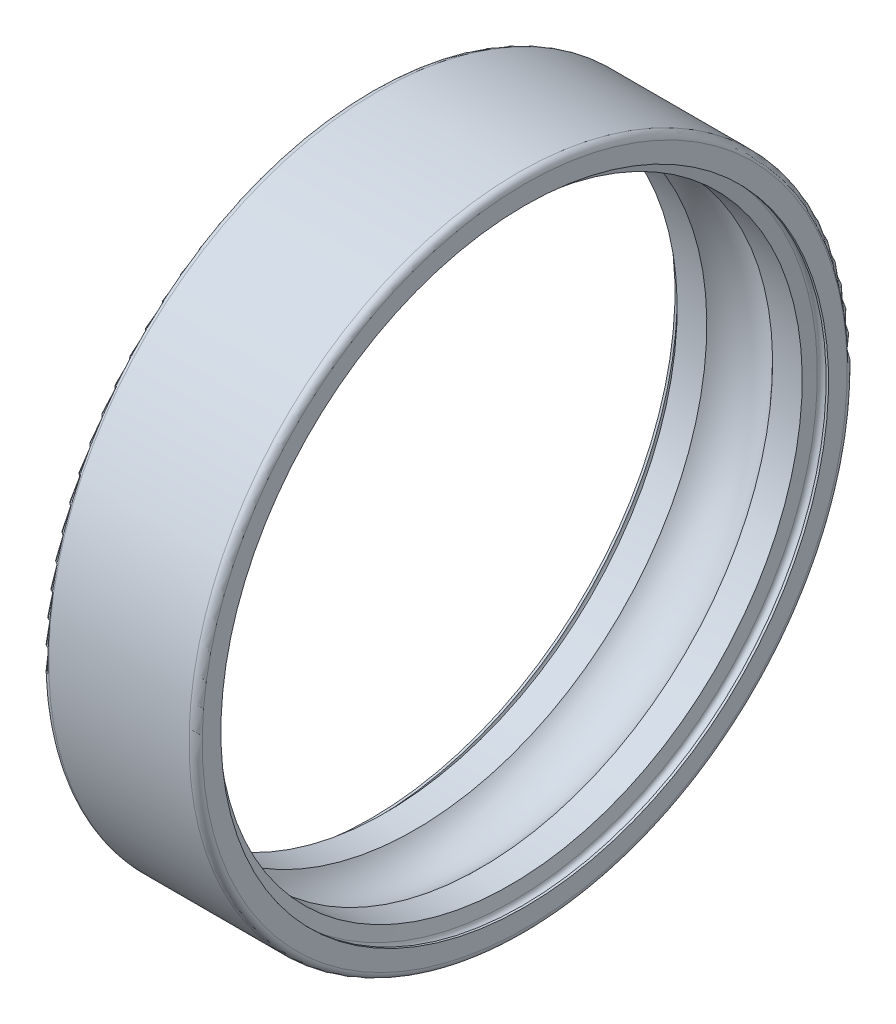
ISO-10303-21;
HEADER;
FILE_DESCRIPTION(('STEP AP214'),'2;1');
FILE_NAME('part.step','',(''),(''),'','','');
FILE_SCHEMA(('AUTOMOTIVE_DESIGN { 1 0 10303 214 1 1 1 1 }'));
ENDSEC;
DATA;
#1=APPLICATION_CONTEXT('core data for automotive mechanical design processes');
#2=APPLICATION_PROTOCOL_DEFINITION('international standard','automotive_design',2000,#1);
#3=PRODUCT_CONTEXT('',#1,'mechanical');
#4=PRODUCT('Part','Part','',(#3));
#5=PRODUCT_RELATED_PRODUCT_CATEGORY('part','',(#4));
#6=PRODUCT_DEFINITION_FORMATION('','',#4);
#7=PRODUCT_DEFINITION_CONTEXT('part definition',#1,'design');
#8=PRODUCT_DEFINITION('design','',#6,#7);
#9=PRODUCT_DEFINITION_SHAPE('','',#8);
#10=(LENGTH_UNIT() NAMED_UNIT(*) SI_UNIT(.MILLI.,.METRE.));
#11=(NAMED_UNIT(*) PLANE_ANGLE_UNIT() SI_UNIT($,.RADIAN.));
#12=(NAMED_UNIT(*) SI_UNIT($,.STERADIAN.) SOLID_ANGLE_UNIT());
#13=UNCERTAINTY_MEASURE_WITH_UNIT(LENGTH_MEASURE(1.E-05),#10,'distance_accuracy_value','');
#14=(GEOMETRIC_REPRESENTATION_CONTEXT(3) GLOBAL_UNCERTAINTY_ASSIGNED_CONTEXT((#13)) GLOBAL_UNIT_ASSIGNED_CONTEXT((#10,
#11,#12)) REPRESENTATION_CONTEXT('',''));
#15=CARTESIAN_POINT('',(0.,0.,0.));
#16=DIRECTION('',(0.,0.,1.));
#17=DIRECTION('',(1.,0.,0.));
#18=AXIS2_PLACEMENT_3D('',#15,#16,#17);
#19=CARTESIAN_POINT('',(6.67,0.,0.));
#20=DIRECTION('',(1.,0.,0.));
#21=DIRECTION('',(0.,0.,-1.));
#22=AXIS2_PLACEMENT_3D('',#19,#20,#21);
#23=TOROIDAL_SURFACE('',#22,13.85,0.22);
#24=CARTESIAN_POINT('',(6.89,0.,0.));
#25=DIRECTION('',(1.,0.,0.));
#26=DIRECTION('',(0.,1.,0.));
#27=AXIS2_PLACEMENT_3D('',#24,#25,#26);
#28=CIRCLE('',#27,13.85);
#29=CARTESIAN_POINT('',(6.89,13.85,0.));
#30=VERTEX_POINT('',#29);
#31=EDGE_CURVE('E10',#30,#30,#28,.T.);
#32=ORIENTED_EDGE('',*,*,#31,.T.);
#33=EDGE_LOOP('',(#32));
#34=FACE_BOUND('',#33,.T.);
#35=CARTESIAN_POINT('',(6.45334229433732,0.,0.));
#36=DIRECTION('',(1.,0.,0.));
#37=DIRECTION('',(0.,1.,0.));
#38=AXIS2_PLACEMENT_3D('',#35,#36,#37);
#39=CIRCLE('',#38,13.8882025990867);
#40=CARTESIAN_POINT('',(6.45334229433732,13.8882025990867,0.));
#41=VERTEX_POINT('',#40);
#42=EDGE_CURVE('E82',#41,#41,#39,.T.);
#43=ORIENTED_EDGE('',*,*,#42,.F.);
#44=EDGE_LOOP('',(#43));
#45=FACE_BOUND('',#44,.T.);
#46=ADVANCED_FACE('F15',(#34,#45),#23,.F.);
#47=CARTESIAN_POINT('',(6.945,0.,0.));
#48=DIRECTION('',(-1.,0.,0.));
#49=DIRECTION('',(0.,1.,0.));
#50=AXIS2_PLACEMENT_3D('',#47,#48,#49);
#51=CYLINDRICAL_SURFACE('',#50,13.85);
#52=CARTESIAN_POINT('',(7.,0.,0.));
#53=DIRECTION('',(1.,0.,0.));
#54=DIRECTION('',(0.,1.,0.));
#55=AXIS2_PLACEMENT_3D('',#52,#53,#54);
#56=CIRCLE('',#55,13.85);
#57=CARTESIAN_POINT('',(7.,13.85,0.));
#58=VERTEX_POINT('',#57);
#59=EDGE_CURVE('E25',#58,#58,#56,.T.);
#60=ORIENTED_EDGE('',*,*,#59,.T.);
#61=EDGE_LOOP('',(#60));
#62=FACE_BOUND('',#61,.T.);
#63=ORIENTED_EDGE('',*,*,#31,.F.);
#64=EDGE_LOOP('',(#63));
#65=FACE_BOUND('',#64,.T.);
#66=ADVANCED_FACE('F121',(#62,#65),#51,.F.);
#67=CARTESIAN_POINT('',(7.,14.275,0.));
#68=DIRECTION('',(1.,0.,0.));
#69=DIRECTION('',(0.,1.,0.));
#70=AXIS2_PLACEMENT_3D('',#67,#68,#69);
#71=PLANE('',#70);
#72=CARTESIAN_POINT('',(7.,0.,0.));
#73=DIRECTION('',(1.,0.,0.));
#74=DIRECTION('',(0.,1.,0.));
#75=AXIS2_PLACEMENT_3D('',#72,#73,#74);
#76=CIRCLE('',#75,14.7);
#77=CARTESIAN_POINT('',(7.,14.7,0.));
#78=VERTEX_POINT('',#77);
#79=EDGE_CURVE('E87',#78,#78,#76,.T.);
#80=ORIENTED_EDGE('',*,*,#79,.T.);
#81=EDGE_LOOP('',(#80));
#82=FACE_BOUND('',#81,.T.);
#83=ORIENTED_EDGE('',*,*,#59,.F.);
#84=EDGE_LOOP('',(#83));
#85=FACE_BOUND('',#84,.T.);
#86=ADVANCED_FACE('F125',(#82,#85),#71,.T.);
#87=CARTESIAN_POINT('',(6.7,0.,0.));
#88=DIRECTION('',(1.,0.,0.));
#89=DIRECTION('',(0.,0.,-1.));
#90=AXIS2_PLACEMENT_3D('',#87,#88,#89);
#91=TOROIDAL_SURFACE('',#90,14.7,0.3);
#92=CARTESIAN_POINT('',(6.7,0.,0.));
#93=DIRECTION('',(1.,0.,0.));
#94=DIRECTION('',(0.,1.,0.));
#95=AXIS2_PLACEMENT_3D('',#92,#93,#94);
#96=CIRCLE('',#95,15.);
#97=CARTESIAN_POINT('',(6.7,15.,0.));
#98=VERTEX_POINT('',#97);
#99=EDGE_CURVE('E85',#98,#98,#96,.T.);
#100=ORIENTED_EDGE('',*,*,#99,.T.);
#101=EDGE_LOOP('',(#100));
#102=FACE_BOUND('',#101,.T.);
#103=ORIENTED_EDGE('',*,*,#79,.F.);
#104=EDGE_LOOP('',(#103));
#105=FACE_BOUND('',#104,.T.);
#106=ADVANCED_FACE('F129',(#102,#105),#91,.T.);
#107=CARTESIAN_POINT('',(3.5,0.,0.));
#108=DIRECTION('',(-1.,0.,0.));
#109=DIRECTION('',(0.,1.,0.));
#110=AXIS2_PLACEMENT_3D('',#107,#108,#109);
#111=CYLINDRICAL_SURFACE('',#110,15.);
#112=CARTESIAN_POINT('',(0.3,0.,0.));
#113=DIRECTION('',(1.,0.,0.));
#114=DIRECTION('',(0.,1.,0.));
#115=AXIS2_PLACEMENT_3D('',#112,#113,#114);
#116=CIRCLE('',#115,15.);
#117=CARTESIAN_POINT('',(0.3,15.,0.));
#118=VERTEX_POINT('',#117);
#119=EDGE_CURVE('E83',#118,#118,#116,.T.);
#120=ORIENTED_EDGE('',*,*,#119,.T.);
#121=EDGE_LOOP('',(#120));
#122=FACE_BOUND('',#121,.T.);
#123=ORIENTED_EDGE('',*,*,#99,.F.);
#124=EDGE_LOOP('',(#123));
#125=FACE_BOUND('',#124,.T.);
#126=ADVANCED_FACE('F131',(#122,#125),#111,.T.);
#127=CARTESIAN_POINT('',(0.3,0.,0.));
#128=DIRECTION('',(1.,0.,0.));
#129=DIRECTION('',(0.,0.,-1.));
#130=AXIS2_PLACEMENT_3D('',#127,#128,#129);
#131=TOROIDAL_SURFACE('',#130,14.7,0.3);
#132=CARTESIAN_POINT('',(0.,0.,0.));
#133=DIRECTION('',(1.,0.,0.));
#134=DIRECTION('',(0.,1.,0.));
#135=AXIS2_PLACEMENT_3D('',#132,#133,#134);
#136=CIRCLE('',#135,14.7);
#137=CARTESIAN_POINT('',(0.,14.7,0.));
#138=VERTEX_POINT('',#137);
#139=EDGE_CURVE('E86',#138,#138,#136,.T.);
#140=ORIENTED_EDGE('',*,*,#139,.T.);
#141=EDGE_LOOP('',(#140));
#142=FACE_BOUND('',#141,.T.);
#143=ORIENTED_EDGE('',*,*,#119,.F.);
#144=EDGE_LOOP('',(#143));
#145=FACE_BOUND('',#144,.T.);
#146=ADVANCED_FACE('F156',(#142,#145),#131,.T.);
#147=CARTESIAN_POINT('',(0.,14.275,0.));
#148=DIRECTION('',(-1.,0.,0.));
#149=DIRECTION('',(0.,-1.,0.));
#150=AXIS2_PLACEMENT_3D('',#147,#148,#149);
#151=PLANE('',#150);
#152=CARTESIAN_POINT('',(0.,0.,0.));
#153=DIRECTION('',(1.,0.,0.));
#154=DIRECTION('',(0.,1.,0.));
#155=AXIS2_PLACEMENT_3D('',#152,#153,#154);
#156=CIRCLE('',#155,13.85);
#157=CARTESIAN_POINT('',(0.,13.85,0.));
#158=VERTEX_POINT('',#157);
#159=EDGE_CURVE('E88',#158,#158,#156,.T.);
#160=ORIENTED_EDGE('',*,*,#159,.T.);
#161=EDGE_LOOP('',(#160));
#162=FACE_BOUND('',#161,.T.);
#163=ORIENTED_EDGE('',*,*,#139,.F.);
#164=EDGE_LOOP('',(#163));
#165=FACE_BOUND('',#164,.T.);
#166=ADVANCED_FACE('F148',(#162,#165),#151,.T.);
#167=CARTESIAN_POINT('',(0.055,0.,0.));
#168=DIRECTION('',(-1.,0.,0.));
#169=DIRECTION('',(0.,1.,0.));
#170=AXIS2_PLACEMENT_3D('',#167,#168,#169);
#171=CYLINDRICAL_SURFACE('',#170,13.85);
#172=CARTESIAN_POINT('',(0.11,0.,0.));
#173=DIRECTION('',(1.,0.,0.));
#174=DIRECTION('',(0.,1.,0.));
#175=AXIS2_PLACEMENT_3D('',#172,#173,#174);
#176=CIRCLE('',#175,13.85);
#177=CARTESIAN_POINT('',(0.11,13.85,0.));
#178=VERTEX_POINT('',#177);
#179=EDGE_CURVE('E74',#178,#178,#176,.T.);
#180=ORIENTED_EDGE('',*,*,#179,.T.);
#181=EDGE_LOOP('',(#180));
#182=FACE_BOUND('',#181,.T.);
#183=ORIENTED_EDGE('',*,*,#159,.F.);
#184=EDGE_LOOP('',(#183));
#185=FACE_BOUND('',#184,.T.);
#186=ADVANCED_FACE('F143',(#182,#185),#171,.F.);
#187=CARTESIAN_POINT('',(0.33,0.,0.));
#188=DIRECTION('',(1.,0.,0.));
#189=DIRECTION('',(0.,0.,-1.));
#190=AXIS2_PLACEMENT_3D('',#187,#188,#189);
#191=TOROIDAL_SURFACE('',#190,13.85,0.22);
#192=CARTESIAN_POINT('',(0.546657705662685,0.,0.));
#193=DIRECTION('',(1.,0.,0.));
#194=DIRECTION('',(0.,1.,0.));
#195=AXIS2_PLACEMENT_3D('',#192,#193,#194);
#196=CIRCLE('',#195,13.8882025990867);
#197=CARTESIAN_POINT('',(0.546657705662685,13.8882025990867,0.));
#198=VERTEX_POINT('',#197);
#199=EDGE_CURVE('E65',#198,#198,#196,.T.);
#200=ORIENTED_EDGE('',*,*,#199,.T.);
#201=EDGE_LOOP('',(#200));
#202=FACE_BOUND('',#201,.T.);
#203=ORIENTED_EDGE('',*,*,#179,.F.);
#204=EDGE_LOOP('',(#203));
#205=FACE_BOUND('',#204,.T.);
#206=ADVANCED_FACE('F138',(#202,#205),#191,.F.);
#207=CARTESIAN_POINT('',(0.598515699833602,0.,0.));
#208=DIRECTION('',(-1.,0.,0.));
#209=DIRECTION('',(0.,1.,0.));
#210=AXIS2_PLACEMENT_3D('',#207,#208,#209);
#211=CONICAL_SURFACE('',#210,13.5941012995434,1.39626340159546);
#212=CARTESIAN_POINT('',(0.650373694004519,0.,0.));
#213=DIRECTION('',(1.,0.,0.));
#214=DIRECTION('',(0.,1.,0.));
#215=AXIS2_PLACEMENT_3D('',#212,#213,#214);
#216=CIRCLE('',#215,13.3);
#217=CARTESIAN_POINT('',(0.650373694004519,13.3,0.));
#218=VERTEX_POINT('',#217);
#219=EDGE_CURVE('E70',#218,#218,#216,.T.);
#220=ORIENTED_EDGE('',*,*,#219,.T.);
#221=EDGE_LOOP('',(#220));
#222=FACE_BOUND('',#221,.T.);
#223=ORIENTED_EDGE('',*,*,#199,.F.);
#224=EDGE_LOOP('',(#223));
#225=FACE_BOUND('',#224,.T.);
#226=ADVANCED_FACE('F17',(#222,#225),#211,.F.);
#227=CARTESIAN_POINT('',(1.32548019603803,0.,0.));
#228=DIRECTION('',(-1.,0.,0.));
#229=DIRECTION('',(0.,1.,0.));
#230=AXIS2_PLACEMENT_3D('',#227,#228,#229);
#231=CYLINDRICAL_SURFACE('',#230,13.3);
#232=CARTESIAN_POINT('',(2.00058669807154,0.,0.));
#233=DIRECTION('',(1.,0.,0.));
#234=DIRECTION('',(0.,1.,0.));
#235=AXIS2_PLACEMENT_3D('',#232,#233,#234);
#236=CIRCLE('',#235,13.3);
#237=CARTESIAN_POINT('',(2.00058669807154,13.3,0.));
#238=VERTEX_POINT('',#237);
#239=EDGE_CURVE('E19',#238,#238,#236,.T.);
#240=ORIENTED_EDGE('',*,*,#239,.T.);
#241=EDGE_LOOP('',(#240));
#242=FACE_BOUND('',#241,.T.);
#243=ORIENTED_EDGE('',*,*,#219,.F.);
#244=EDGE_LOOP('',(#243));
#245=FACE_BOUND('',#244,.T.);
#246=ADVANCED_FACE('F116',(#242,#245),#231,.F.);
#247=CARTESIAN_POINT('',(3.5,0.,0.));
#248=DIRECTION('',(1.,0.,0.));
#249=DIRECTION('',(0.,0.,-1.));
#250=AXIS2_PLACEMENT_3D('',#247,#248,#249);
#251=TOROIDAL_SURFACE('',#250,12.,1.9845);
#252=CARTESIAN_POINT('',(4.99941330192846,0.,0.));
#253=DIRECTION('',(1.,0.,0.));
#254=DIRECTION('',(0.,1.,0.));
#255=AXIS2_PLACEMENT_3D('',#252,#253,#254);
#256=CIRCLE('',#255,13.3);
#257=CARTESIAN_POINT('',(4.99941330192846,13.3,0.));
#258=VERTEX_POINT('',#257);
#259=EDGE_CURVE('E76',#258,#258,#256,.T.);
#260=ORIENTED_EDGE('',*,*,#259,.T.);
#261=EDGE_LOOP('',(#260));
#262=FACE_BOUND('',#261,.T.);
#263=ORIENTED_EDGE('',*,*,#239,.F.);
#264=EDGE_LOOP('',(#263));
#265=FACE_BOUND('',#264,.T.);
#266=ADVANCED_FACE('F102',(#262,#265),#251,.F.);
#267=CARTESIAN_POINT('',(5.67451980396197,0.,0.));
#268=DIRECTION('',(-1.,0.,0.));
#269=DIRECTION('',(0.,1.,0.));
#270=AXIS2_PLACEMENT_3D('',#267,#268,#269);
#271=CYLINDRICAL_SURFACE('',#270,13.3);
#272=CARTESIAN_POINT('',(6.34962630599548,0.,0.));
#273=DIRECTION('',(1.,0.,0.));
#274=DIRECTION('',(0.,1.,0.));
#275=AXIS2_PLACEMENT_3D('',#272,#273,#274);
#276=CIRCLE('',#275,13.3);
#277=CARTESIAN_POINT('',(6.34962630599548,13.3,0.));
#278=VERTEX_POINT('',#277);
#279=EDGE_CURVE('E80',#278,#278,#276,.T.);
#280=ORIENTED_EDGE('',*,*,#279,.T.);
#281=EDGE_LOOP('',(#280));
#282=FACE_BOUND('',#281,.T.);
#283=ORIENTED_EDGE('',*,*,#259,.F.);
#284=EDGE_LOOP('',(#283));
#285=FACE_BOUND('',#284,.T.);
#286=ADVANCED_FACE('F105',(#282,#285),#271,.F.);
#287=CARTESIAN_POINT('',(6.4014843001664,0.,0.));
#288=DIRECTION('',(1.,0.,0.));
#289=DIRECTION('',(0.,1.,0.));
#290=AXIS2_PLACEMENT_3D('',#287,#288,#289);
#291=CONICAL_SURFACE('',#290,13.5941012995434,1.39626340159546);
#292=ORIENTED_EDGE('',*,*,#42,.T.);
#293=EDGE_LOOP('',(#292));
#294=FACE_BOUND('',#293,.T.);
#295=ORIENTED_EDGE('',*,*,#279,.F.);
#296=EDGE_LOOP('',(#295));
#297=FACE_BOUND('',#296,.T.);
#298=ADVANCED_FACE('F107',(#294,#297),#291,.F.);
#299=CLOSED_SHELL('',(#46,#66,#86,#106,#126,#146,#166,#186,#206,#226,#246,#266,#286,#298));
#300=MANIFOLD_SOLID_BREP('B1',#299);
#301=ADVANCED_BREP_SHAPE_REPRESENTATION('',(#18,#300),#14);
#302=SHAPE_DEFINITION_REPRESENTATION(#9,#301);
ENDSEC;
END-ISO-10303-21;
